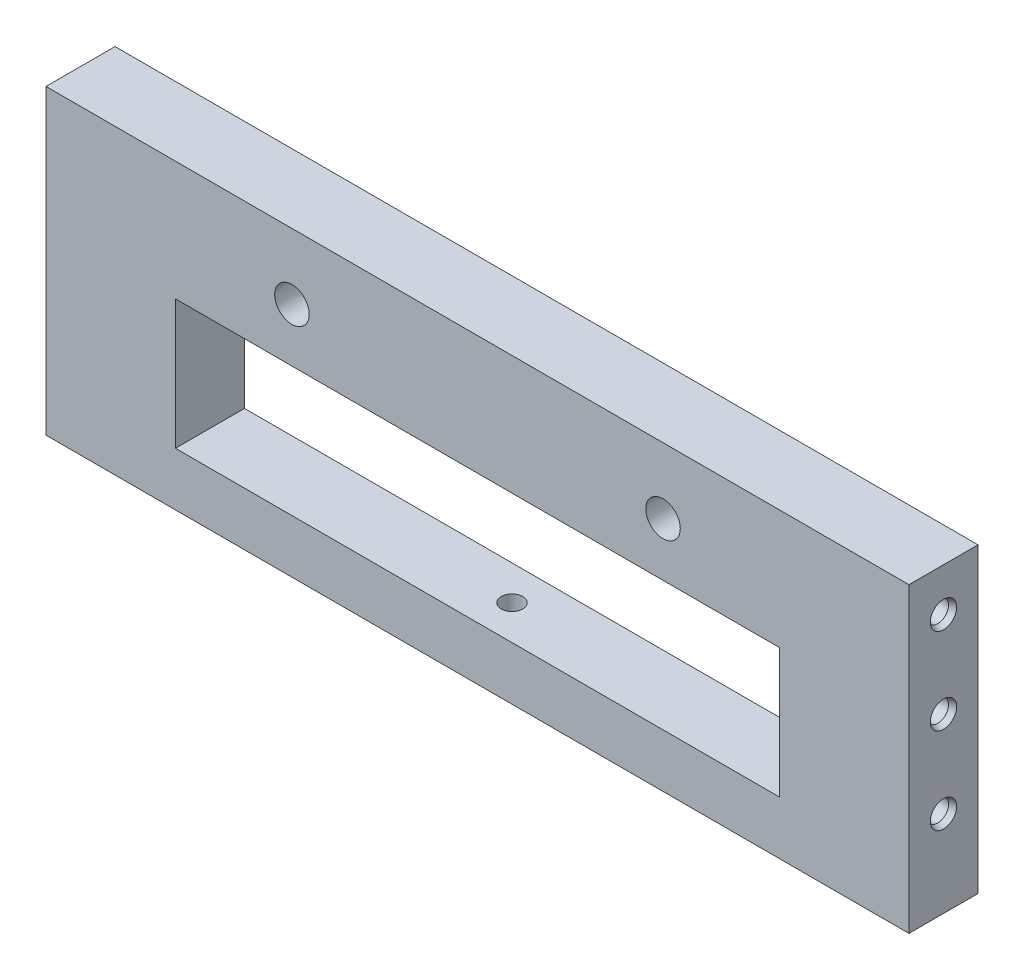
ISO-10303-21;
HEADER;
FILE_DESCRIPTION(('STEP AP214'),'2;1');
FILE_NAME('part.step','',(''),(''),'','','');
FILE_SCHEMA(('AUTOMOTIVE_DESIGN { 1 0 10303 214 1 1 1 1 }'));
ENDSEC;
DATA;
#1=APPLICATION_CONTEXT('core data for automotive mechanical design processes');
#2=APPLICATION_PROTOCOL_DEFINITION('international standard','automotive_design',2000,#1);
#3=PRODUCT_CONTEXT('',#1,'mechanical');
#4=PRODUCT('Part','Part','',(#3));
#5=PRODUCT_RELATED_PRODUCT_CATEGORY('part','',(#4));
#6=PRODUCT_DEFINITION_FORMATION('','',#4);
#7=PRODUCT_DEFINITION_CONTEXT('part definition',#1,'design');
#8=PRODUCT_DEFINITION('design','',#6,#7);
#9=PRODUCT_DEFINITION_SHAPE('','',#8);
#10=(LENGTH_UNIT() NAMED_UNIT(*) SI_UNIT(.MILLI.,.METRE.));
#11=(NAMED_UNIT(*) PLANE_ANGLE_UNIT() SI_UNIT($,.RADIAN.));
#12=(NAMED_UNIT(*) SI_UNIT($,.STERADIAN.) SOLID_ANGLE_UNIT());
#13=UNCERTAINTY_MEASURE_WITH_UNIT(LENGTH_MEASURE(1.E-05),#10,'distance_accuracy_value','');
#14=(GEOMETRIC_REPRESENTATION_CONTEXT(3) GLOBAL_UNCERTAINTY_ASSIGNED_CONTEXT((#13)) GLOBAL_UNIT_ASSIGNED_CONTEXT((#10,
#11,#12)) REPRESENTATION_CONTEXT('',''));
#15=CARTESIAN_POINT('',(0.,0.,0.));
#16=DIRECTION('',(0.,0.,1.));
#17=DIRECTION('',(1.,0.,0.));
#18=AXIS2_PLACEMENT_3D('',#15,#16,#17);
#19=CARTESIAN_POINT('',(-50.,0.,8.));
#20=DIRECTION('',(-1.,0.,0.));
#21=DIRECTION('',(0.,0.,1.));
#22=AXIS2_PLACEMENT_3D('',#19,#20,#21);
#23=PLANE('',#22);
#24=CARTESIAN_POINT('',(-50.,30.,4.));
#25=DIRECTION('',(-1.,0.,0.));
#26=DIRECTION('',(0.,0.,1.));
#27=AXIS2_PLACEMENT_3D('',#24,#25,#26);
#28=CIRCLE('',#27,1.525);
#29=CARTESIAN_POINT('',(-50.,30.,5.525));
#30=VERTEX_POINT('',#29);
#31=EDGE_CURVE('E267',#30,#30,#28,.T.);
#32=ORIENTED_EDGE('',*,*,#31,.F.);
#33=EDGE_LOOP('',(#32));
#34=FACE_BOUND('',#33,.T.);
#35=CARTESIAN_POINT('',(-50.,20.,4.));
#36=DIRECTION('',(-1.,0.,0.));
#37=DIRECTION('',(0.,0.,1.));
#38=AXIS2_PLACEMENT_3D('',#35,#36,#37);
#39=CIRCLE('',#38,1.525);
#40=CARTESIAN_POINT('',(-50.,20.,5.525));
#41=VERTEX_POINT('',#40);
#42=EDGE_CURVE('E276',#41,#41,#39,.T.);
#43=ORIENTED_EDGE('',*,*,#42,.F.);
#44=EDGE_LOOP('',(#43));
#45=FACE_BOUND('',#44,.T.);
#46=CARTESIAN_POINT('',(-50.,10.,4.));
#47=DIRECTION('',(-1.,0.,0.));
#48=DIRECTION('',(0.,0.,1.));
#49=AXIS2_PLACEMENT_3D('',#46,#47,#48);
#50=CIRCLE('',#49,1.525);
#51=CARTESIAN_POINT('',(-50.,10.,5.525));
#52=VERTEX_POINT('',#51);
#53=EDGE_CURVE('E285',#52,#52,#50,.T.);
#54=ORIENTED_EDGE('',*,*,#53,.F.);
#55=EDGE_LOOP('',(#54));
#56=FACE_BOUND('',#55,.T.);
#57=DIRECTION('',(0.,1.,0.));
#58=VECTOR('',#57,1.);
#59=CARTESIAN_POINT('',(-50.,0.,0.));
#60=LINE('',#59,#58);
#61=CARTESIAN_POINT('',(-50.,0.,0.));
#62=VERTEX_POINT('',#61);
#63=CARTESIAN_POINT('',(-50.,35.,0.));
#64=VERTEX_POINT('',#63);
#65=EDGE_CURVE('E156',#62,#64,#60,.T.);
#66=ORIENTED_EDGE('',*,*,#65,.F.);
#67=DIRECTION('',(0.,0.,-1.));
#68=VECTOR('',#67,1.);
#69=CARTESIAN_POINT('',(-50.,0.,8.));
#70=LINE('',#69,#68);
#71=CARTESIAN_POINT('',(-50.,0.,8.));
#72=VERTEX_POINT('',#71);
#73=EDGE_CURVE('E11',#72,#62,#70,.T.);
#74=ORIENTED_EDGE('',*,*,#73,.F.);
#75=DIRECTION('',(0.,1.,0.));
#76=VECTOR('',#75,1.);
#77=CARTESIAN_POINT('',(-50.,0.,8.));
#78=LINE('',#77,#76);
#79=CARTESIAN_POINT('',(-50.,35.,8.));
#80=VERTEX_POINT('',#79);
#81=EDGE_CURVE('E129',#72,#80,#78,.T.);
#82=ORIENTED_EDGE('',*,*,#81,.T.);
#83=DIRECTION('',(0.,0.,-1.));
#84=VECTOR('',#83,1.);
#85=CARTESIAN_POINT('',(-50.,35.,8.));
#86=LINE('',#85,#84);
#87=EDGE_CURVE('E57',#80,#64,#86,.T.);
#88=ORIENTED_EDGE('',*,*,#87,.T.);
#89=EDGE_LOOP('',(#66,#74,#82,#88));
#90=FACE_BOUND('',#89,.T.);
#91=ADVANCED_FACE('F38',(#34,#45,#56,#90),#23,.T.);
#92=CARTESIAN_POINT('',(0.,0.,8.));
#93=DIRECTION('',(0.,-1.,0.));
#94=DIRECTION('',(1.,0.,0.));
#95=AXIS2_PLACEMENT_3D('',#92,#93,#94);
#96=PLANE('',#95);
#97=CARTESIAN_POINT('',(40.,0.,4.));
#98=DIRECTION('',(0.,-1.,0.));
#99=DIRECTION('',(0.,0.,-1.));
#100=AXIS2_PLACEMENT_3D('',#97,#98,#99);
#101=CIRCLE('',#100,1.525);
#102=CARTESIAN_POINT('',(40.,0.,2.47500000000001));
#103=VERTEX_POINT('',#102);
#104=EDGE_CURVE('E614',#103,#103,#101,.T.);
#105=ORIENTED_EDGE('',*,*,#104,.F.);
#106=EDGE_LOOP('',(#105));
#107=FACE_BOUND('',#106,.T.);
#108=CARTESIAN_POINT('',(0.,0.,4.));
#109=DIRECTION('',(0.,-1.,0.));
#110=DIRECTION('',(0.,0.,-1.));
#111=AXIS2_PLACEMENT_3D('',#108,#109,#110);
#112=CIRCLE('',#111,1.525);
#113=CARTESIAN_POINT('',(0.,0.,2.475));
#114=VERTEX_POINT('',#113);
#115=EDGE_CURVE('E253',#114,#114,#112,.T.);
#116=ORIENTED_EDGE('',*,*,#115,.F.);
#117=EDGE_LOOP('',(#116));
#118=FACE_BOUND('',#117,.T.);
#119=CARTESIAN_POINT('',(-40.,0.,4.));
#120=DIRECTION('',(0.,-1.,0.));
#121=DIRECTION('',(0.,0.,-1.));
#122=AXIS2_PLACEMENT_3D('',#119,#120,#121);
#123=CIRCLE('',#122,1.525);
#124=CARTESIAN_POINT('',(-40.,0.,2.475));
#125=VERTEX_POINT('',#124);
#126=EDGE_CURVE('E247',#125,#125,#123,.T.);
#127=ORIENTED_EDGE('',*,*,#126,.F.);
#128=EDGE_LOOP('',(#127));
#129=FACE_BOUND('',#128,.T.);
#130=DIRECTION('',(-1.,0.,0.));
#131=VECTOR('',#130,1.);
#132=CARTESIAN_POINT('',(0.,0.,0.));
#133=LINE('',#132,#131);
#134=CARTESIAN_POINT('',(50.,0.,0.));
#135=VERTEX_POINT('',#134);
#136=EDGE_CURVE('E118',#135,#62,#133,.T.);
#137=ORIENTED_EDGE('',*,*,#136,.F.);
#138=DIRECTION('',(0.,0.,-1.));
#139=VECTOR('',#138,1.);
#140=CARTESIAN_POINT('',(50.,0.,8.));
#141=LINE('',#140,#139);
#142=CARTESIAN_POINT('',(50.,0.,8.));
#143=VERTEX_POINT('',#142);
#144=EDGE_CURVE('E48',#143,#135,#141,.T.);
#145=ORIENTED_EDGE('',*,*,#144,.F.);
#146=DIRECTION('',(-1.,0.,0.));
#147=VECTOR('',#146,1.);
#148=CARTESIAN_POINT('',(0.,0.,8.));
#149=LINE('',#148,#147);
#150=EDGE_CURVE('E116',#143,#72,#149,.T.);
#151=ORIENTED_EDGE('',*,*,#150,.T.);
#152=ORIENTED_EDGE('',*,*,#73,.T.);
#153=EDGE_LOOP('',(#137,#145,#151,#152));
#154=FACE_BOUND('',#153,.T.);
#155=ADVANCED_FACE('F115',(#107,#118,#129,#154),#96,.T.);
#156=CARTESIAN_POINT('',(50.,0.,8.));
#157=DIRECTION('',(1.,0.,0.));
#158=DIRECTION('',(0.,0.,-1.));
#159=AXIS2_PLACEMENT_3D('',#156,#157,#158);
#160=PLANE('',#159);
#161=CARTESIAN_POINT('',(50.,30.,4.));
#162=DIRECTION('',(1.,0.,0.));
#163=DIRECTION('',(0.,0.,-1.));
#164=AXIS2_PLACEMENT_3D('',#161,#162,#163);
#165=CIRCLE('',#164,1.525);
#166=CARTESIAN_POINT('',(50.,30.,2.475));
#167=VERTEX_POINT('',#166);
#168=EDGE_CURVE('E294',#167,#167,#165,.T.);
#169=ORIENTED_EDGE('',*,*,#168,.F.);
#170=EDGE_LOOP('',(#169));
#171=FACE_BOUND('',#170,.T.);
#172=CARTESIAN_POINT('',(50.,20.,4.));
#173=DIRECTION('',(1.,0.,0.));
#174=DIRECTION('',(0.,0.,-1.));
#175=AXIS2_PLACEMENT_3D('',#172,#173,#174);
#176=CIRCLE('',#175,1.525);
#177=CARTESIAN_POINT('',(50.,20.,2.475));
#178=VERTEX_POINT('',#177);
#179=EDGE_CURVE('E303',#178,#178,#176,.T.);
#180=ORIENTED_EDGE('',*,*,#179,.F.);
#181=EDGE_LOOP('',(#180));
#182=FACE_BOUND('',#181,.T.);
#183=CARTESIAN_POINT('',(50.,10.,4.));
#184=DIRECTION('',(1.,0.,0.));
#185=DIRECTION('',(0.,0.,-1.));
#186=AXIS2_PLACEMENT_3D('',#183,#184,#185);
#187=CIRCLE('',#186,1.525);
#188=CARTESIAN_POINT('',(50.,10.,2.475));
#189=VERTEX_POINT('',#188);
#190=EDGE_CURVE('E312',#189,#189,#187,.T.);
#191=ORIENTED_EDGE('',*,*,#190,.F.);
#192=EDGE_LOOP('',(#191));
#193=FACE_BOUND('',#192,.T.);
#194=DIRECTION('',(0.,-1.,0.));
#195=VECTOR('',#194,1.);
#196=CARTESIAN_POINT('',(50.,0.,0.));
#197=LINE('',#196,#195);
#198=CARTESIAN_POINT('',(50.,35.,0.));
#199=VERTEX_POINT('',#198);
#200=EDGE_CURVE('E159',#199,#135,#197,.T.);
#201=ORIENTED_EDGE('',*,*,#200,.F.);
#202=DIRECTION('',(0.,0.,-1.));
#203=VECTOR('',#202,1.);
#204=CARTESIAN_POINT('',(50.,35.,8.));
#205=LINE('',#204,#203);
#206=CARTESIAN_POINT('',(50.,35.,8.));
#207=VERTEX_POINT('',#206);
#208=EDGE_CURVE('E83',#207,#199,#205,.T.);
#209=ORIENTED_EDGE('',*,*,#208,.F.);
#210=DIRECTION('',(0.,-1.,0.));
#211=VECTOR('',#210,1.);
#212=CARTESIAN_POINT('',(50.,0.,8.));
#213=LINE('',#212,#211);
#214=EDGE_CURVE('E128',#207,#143,#213,.T.);
#215=ORIENTED_EDGE('',*,*,#214,.T.);
#216=ORIENTED_EDGE('',*,*,#144,.T.);
#217=EDGE_LOOP('',(#201,#209,#215,#216));
#218=FACE_BOUND('',#217,.T.);
#219=ADVANCED_FACE('F131',(#171,#182,#193,#218),#160,.T.);
#220=CARTESIAN_POINT('',(0.,6.185,8.));
#221=DIRECTION('',(0.,1.,0.));
#222=DIRECTION('',(0.,0.,1.));
#223=AXIS2_PLACEMENT_3D('',#220,#221,#222);
#224=PLANE('',#223);
#225=CARTESIAN_POINT('',(0.,6.185,4.));
#226=DIRECTION('',(0.,1.,0.));
#227=DIRECTION('',(0.,0.,1.));
#228=AXIS2_PLACEMENT_3D('',#225,#226,#227);
#229=CIRCLE('',#228,1.24999999999999);
#230=CARTESIAN_POINT('',(0.,6.185,5.24999999999999));
#231=VERTEX_POINT('',#230);
#232=EDGE_CURVE('E42',#231,#231,#229,.T.);
#233=ORIENTED_EDGE('',*,*,#232,.F.);
#234=EDGE_LOOP('',(#233));
#235=FACE_BOUND('',#234,.T.);
#236=DIRECTION('',(1.,0.,0.));
#237=VECTOR('',#236,1.);
#238=CARTESIAN_POINT('',(0.,6.185,0.));
#239=LINE('',#238,#237);
#240=CARTESIAN_POINT('',(-35.,6.185,0.));
#241=VERTEX_POINT('',#240);
#242=CARTESIAN_POINT('',(35.,6.185,0.));
#243=VERTEX_POINT('',#242);
#244=EDGE_CURVE('E138',#241,#243,#239,.T.);
#245=ORIENTED_EDGE('',*,*,#244,.F.);
#246=DIRECTION('',(0.,0.,-1.));
#247=VECTOR('',#246,1.);
#248=CARTESIAN_POINT('',(-35.,6.185,8.));
#249=LINE('',#248,#247);
#250=CARTESIAN_POINT('',(-35.,6.185,8.));
#251=VERTEX_POINT('',#250);
#252=EDGE_CURVE('E95',#251,#241,#249,.T.);
#253=ORIENTED_EDGE('',*,*,#252,.F.);
#254=DIRECTION('',(1.,0.,0.));
#255=VECTOR('',#254,1.);
#256=CARTESIAN_POINT('',(0.,6.185,8.));
#257=LINE('',#256,#255);
#258=CARTESIAN_POINT('',(35.,6.185,8.));
#259=VERTEX_POINT('',#258);
#260=EDGE_CURVE('E164',#251,#259,#257,.T.);
#261=ORIENTED_EDGE('',*,*,#260,.T.);
#262=DIRECTION('',(0.,0.,-1.));
#263=VECTOR('',#262,1.);
#264=CARTESIAN_POINT('',(35.,6.185,8.));
#265=LINE('',#264,#263);
#266=EDGE_CURVE('E134',#259,#243,#265,.T.);
#267=ORIENTED_EDGE('',*,*,#266,.T.);
#268=EDGE_LOOP('',(#245,#253,#261,#267));
#269=FACE_BOUND('',#268,.T.);
#270=ADVANCED_FACE('F40',(#235,#269),#224,.T.);
#271=CARTESIAN_POINT('',(-35.,0.,8.));
#272=DIRECTION('',(-1.,0.,0.));
#273=DIRECTION('',(0.,0.,1.));
#274=AXIS2_PLACEMENT_3D('',#271,#272,#273);
#275=PLANE('',#274);
#276=DIRECTION('',(0.,1.,0.));
#277=VECTOR('',#276,1.);
#278=CARTESIAN_POINT('',(-35.,0.,0.));
#279=LINE('',#278,#277);
#280=CARTESIAN_POINT('',(-35.,21.185,0.));
#281=VERTEX_POINT('',#280);
#282=EDGE_CURVE('E141',#241,#281,#279,.T.);
#283=ORIENTED_EDGE('',*,*,#282,.T.);
#284=DIRECTION('',(0.,0.,-1.));
#285=VECTOR('',#284,1.);
#286=CARTESIAN_POINT('',(-35.,21.185,8.));
#287=LINE('',#286,#285);
#288=CARTESIAN_POINT('',(-35.,21.185,8.));
#289=VERTEX_POINT('',#288);
#290=EDGE_CURVE('E170',#289,#281,#287,.T.);
#291=ORIENTED_EDGE('',*,*,#290,.F.);
#292=DIRECTION('',(0.,1.,0.));
#293=VECTOR('',#292,1.);
#294=CARTESIAN_POINT('',(-35.,0.,8.));
#295=LINE('',#294,#293);
#296=EDGE_CURVE('E176',#251,#289,#295,.T.);
#297=ORIENTED_EDGE('',*,*,#296,.F.);
#298=ORIENTED_EDGE('',*,*,#252,.T.);
#299=EDGE_LOOP('',(#283,#291,#297,#298));
#300=FACE_BOUND('',#299,.T.);
#301=ADVANCED_FACE('F174',(#300),#275,.F.);
#302=CARTESIAN_POINT('',(0.,21.185,8.));
#303=DIRECTION('',(0.,1.,0.));
#304=DIRECTION('',(0.,0.,1.));
#305=AXIS2_PLACEMENT_3D('',#302,#303,#304);
#306=PLANE('',#305);
#307=DIRECTION('',(1.,0.,0.));
#308=VECTOR('',#307,1.);
#309=CARTESIAN_POINT('',(0.,21.185,0.));
#310=LINE('',#309,#308);
#311=CARTESIAN_POINT('',(35.,21.185,0.));
#312=VERTEX_POINT('',#311);
#313=EDGE_CURVE('E144',#281,#312,#310,.T.);
#314=ORIENTED_EDGE('',*,*,#313,.T.);
#315=DIRECTION('',(0.,0.,-1.));
#316=VECTOR('',#315,1.);
#317=CARTESIAN_POINT('',(35.,21.185,8.));
#318=LINE('',#317,#316);
#319=CARTESIAN_POINT('',(35.,21.185,8.));
#320=VERTEX_POINT('',#319);
#321=EDGE_CURVE('E168',#320,#312,#318,.T.);
#322=ORIENTED_EDGE('',*,*,#321,.F.);
#323=DIRECTION('',(1.,0.,0.));
#324=VECTOR('',#323,1.);
#325=CARTESIAN_POINT('',(0.,21.185,8.));
#326=LINE('',#325,#324);
#327=EDGE_CURVE('E192',#289,#320,#326,.T.);
#328=ORIENTED_EDGE('',*,*,#327,.F.);
#329=ORIENTED_EDGE('',*,*,#290,.T.);
#330=EDGE_LOOP('',(#314,#322,#328,#329));
#331=FACE_BOUND('',#330,.T.);
#332=ADVANCED_FACE('F191',(#331),#306,.F.);
#333=CARTESIAN_POINT('',(-21.5,27.37,8.));
#334=DIRECTION('',(0.,0.,-1.));
#335=DIRECTION('',(-1.,0.,0.));
#336=AXIS2_PLACEMENT_3D('',#333,#334,#335);
#337=CYLINDRICAL_SURFACE('',#336,2.);
#338=CARTESIAN_POINT('',(-21.5,27.37,8.));
#339=DIRECTION('',(0.,0.,1.));
#340=DIRECTION('',(1.,0.,0.));
#341=AXIS2_PLACEMENT_3D('',#338,#339,#340);
#342=CIRCLE('',#341,2.);
#343=CARTESIAN_POINT('',(-19.5,27.37,8.));
#344=VERTEX_POINT('',#343);
#345=EDGE_CURVE('E202',#344,#344,#342,.T.);
#346=ORIENTED_EDGE('',*,*,#345,.T.);
#347=EDGE_LOOP('',(#346));
#348=FACE_BOUND('',#347,.T.);
#349=CARTESIAN_POINT('',(-21.5,27.37,0.));
#350=DIRECTION('',(0.,0.,1.));
#351=DIRECTION('',(1.,0.,0.));
#352=AXIS2_PLACEMENT_3D('',#349,#350,#351);
#353=CIRCLE('',#352,2.);
#354=CARTESIAN_POINT('',(-19.5,27.37,0.));
#355=VERTEX_POINT('',#354);
#356=EDGE_CURVE('E153',#355,#355,#353,.T.);
#357=ORIENTED_EDGE('',*,*,#356,.F.);
#358=EDGE_LOOP('',(#357));
#359=FACE_BOUND('',#358,.T.);
#360=ADVANCED_FACE('F227',(#348,#359),#337,.F.);
#361=CARTESIAN_POINT('',(21.5,27.37,8.));
#362=DIRECTION('',(0.,0.,-1.));
#363=DIRECTION('',(-1.,0.,0.));
#364=AXIS2_PLACEMENT_3D('',#361,#362,#363);
#365=CYLINDRICAL_SURFACE('',#364,2.);
#366=CARTESIAN_POINT('',(21.5,27.37,8.));
#367=DIRECTION('',(0.,0.,1.));
#368=DIRECTION('',(1.,0.,0.));
#369=AXIS2_PLACEMENT_3D('',#366,#367,#368);
#370=CIRCLE('',#369,2.);
#371=CARTESIAN_POINT('',(23.5,27.37,8.));
#372=VERTEX_POINT('',#371);
#373=EDGE_CURVE('E195',#372,#372,#370,.T.);
#374=ORIENTED_EDGE('',*,*,#373,.T.);
#375=EDGE_LOOP('',(#374));
#376=FACE_BOUND('',#375,.T.);
#377=CARTESIAN_POINT('',(21.5,27.37,0.));
#378=DIRECTION('',(0.,0.,1.));
#379=DIRECTION('',(1.,0.,0.));
#380=AXIS2_PLACEMENT_3D('',#377,#378,#379);
#381=CIRCLE('',#380,2.);
#382=CARTESIAN_POINT('',(23.5,27.37,0.));
#383=VERTEX_POINT('',#382);
#384=EDGE_CURVE('E150',#383,#383,#381,.T.);
#385=ORIENTED_EDGE('',*,*,#384,.F.);
#386=EDGE_LOOP('',(#385));
#387=FACE_BOUND('',#386,.T.);
#388=ADVANCED_FACE('F212',(#376,#387),#365,.F.);
#389=CARTESIAN_POINT('',(35.,0.,8.));
#390=DIRECTION('',(-1.,0.,0.));
#391=DIRECTION('',(0.,0.,1.));
#392=AXIS2_PLACEMENT_3D('',#389,#390,#391);
#393=PLANE('',#392);
#394=DIRECTION('',(0.,1.,0.));
#395=VECTOR('',#394,1.);
#396=CARTESIAN_POINT('',(35.,0.,0.));
#397=LINE('',#396,#395);
#398=EDGE_CURVE('E147',#243,#312,#397,.T.);
#399=ORIENTED_EDGE('',*,*,#398,.F.);
#400=ORIENTED_EDGE('',*,*,#266,.F.);
#401=DIRECTION('',(0.,1.,0.));
#402=VECTOR('',#401,1.);
#403=CARTESIAN_POINT('',(35.,0.,8.));
#404=LINE('',#403,#402);
#405=EDGE_CURVE('E187',#259,#320,#404,.T.);
#406=ORIENTED_EDGE('',*,*,#405,.T.);
#407=ORIENTED_EDGE('',*,*,#321,.T.);
#408=EDGE_LOOP('',(#399,#400,#406,#407));
#409=FACE_BOUND('',#408,.T.);
#410=ADVANCED_FACE('F186',(#409),#393,.T.);
#411=CARTESIAN_POINT('',(0.,35.,8.));
#412=DIRECTION('',(0.,1.,0.));
#413=DIRECTION('',(0.,0.,1.));
#414=AXIS2_PLACEMENT_3D('',#411,#412,#413);
#415=PLANE('',#414);
#416=DIRECTION('',(1.,0.,0.));
#417=VECTOR('',#416,1.);
#418=CARTESIAN_POINT('',(0.,35.,0.));
#419=LINE('',#418,#417);
#420=EDGE_CURVE('E161',#64,#199,#419,.T.);
#421=ORIENTED_EDGE('',*,*,#420,.F.);
#422=ORIENTED_EDGE('',*,*,#87,.F.);
#423=DIRECTION('',(1.,0.,0.));
#424=VECTOR('',#423,1.);
#425=CARTESIAN_POINT('',(0.,35.,8.));
#426=LINE('',#425,#424);
#427=EDGE_CURVE('E132',#80,#207,#426,.T.);
#428=ORIENTED_EDGE('',*,*,#427,.T.);
#429=ORIENTED_EDGE('',*,*,#208,.T.);
#430=EDGE_LOOP('',(#421,#422,#428,#429));
#431=FACE_BOUND('',#430,.T.);
#432=ADVANCED_FACE('F204',(#431),#415,.T.);
#433=CARTESIAN_POINT('',(0.,0.,8.));
#434=DIRECTION('',(0.,0.,1.));
#435=DIRECTION('',(1.,0.,0.));
#436=AXIS2_PLACEMENT_3D('',#433,#434,#435);
#437=PLANE('',#436);
#438=ORIENTED_EDGE('',*,*,#260,.F.);
#439=ORIENTED_EDGE('',*,*,#296,.T.);
#440=ORIENTED_EDGE('',*,*,#327,.T.);
#441=ORIENTED_EDGE('',*,*,#405,.F.);
#442=EDGE_LOOP('',(#438,#439,#440,#441));
#443=FACE_BOUND('',#442,.T.);
#444=ORIENTED_EDGE('',*,*,#373,.F.);
#445=EDGE_LOOP('',(#444));
#446=FACE_BOUND('',#445,.T.);
#447=ORIENTED_EDGE('',*,*,#345,.F.);
#448=EDGE_LOOP('',(#447));
#449=FACE_BOUND('',#448,.T.);
#450=ORIENTED_EDGE('',*,*,#81,.F.);
#451=ORIENTED_EDGE('',*,*,#150,.F.);
#452=ORIENTED_EDGE('',*,*,#214,.F.);
#453=ORIENTED_EDGE('',*,*,#427,.F.);
#454=EDGE_LOOP('',(#450,#451,#452,#453));
#455=FACE_BOUND('',#454,.T.);
#456=ADVANCED_FACE('F126',(#443,#446,#449,#455),#437,.T.);
#457=CARTESIAN_POINT('',(0.,0.,0.));
#458=DIRECTION('',(0.,0.,1.));
#459=DIRECTION('',(1.,0.,0.));
#460=AXIS2_PLACEMENT_3D('',#457,#458,#459);
#461=PLANE('',#460);
#462=ORIENTED_EDGE('',*,*,#244,.T.);
#463=ORIENTED_EDGE('',*,*,#398,.T.);
#464=ORIENTED_EDGE('',*,*,#313,.F.);
#465=ORIENTED_EDGE('',*,*,#282,.F.);
#466=EDGE_LOOP('',(#462,#463,#464,#465));
#467=FACE_BOUND('',#466,.T.);
#468=ORIENTED_EDGE('',*,*,#384,.T.);
#469=EDGE_LOOP('',(#468));
#470=FACE_BOUND('',#469,.T.);
#471=ORIENTED_EDGE('',*,*,#356,.T.);
#472=EDGE_LOOP('',(#471));
#473=FACE_BOUND('',#472,.T.);
#474=ORIENTED_EDGE('',*,*,#65,.T.);
#475=ORIENTED_EDGE('',*,*,#420,.T.);
#476=ORIENTED_EDGE('',*,*,#200,.T.);
#477=ORIENTED_EDGE('',*,*,#136,.T.);
#478=EDGE_LOOP('',(#474,#475,#476,#477));
#479=FACE_BOUND('',#478,.T.);
#480=ADVANCED_FACE('F180',(#467,#470,#473,#479),#461,.F.);
#481=CARTESIAN_POINT('',(43.2510757737845,10.,4.));
#482=DIRECTION('',(1.,0.,0.));
#483=DIRECTION('',(0.,0.,-1.));
#484=AXIS2_PLACEMENT_3D('',#481,#482,#483);
#485=CONICAL_SURFACE('',#484,1.25,1.02974425867665);
#486=CARTESIAN_POINT('',(42.5,10.,4.));
#487=VERTEX_POINT('',#486);
#488=VERTEX_LOOP('',#487);
#489=FACE_BOUND('',#488,.T.);
#490=CARTESIAN_POINT('',(43.2510757737845,10.,4.));
#491=DIRECTION('',(1.,0.,0.));
#492=DIRECTION('',(0.,0.,-1.));
#493=AXIS2_PLACEMENT_3D('',#490,#491,#492);
#494=CIRCLE('',#493,1.25);
#495=CARTESIAN_POINT('',(43.2510757737845,10.,2.75));
#496=VERTEX_POINT('',#495);
#497=EDGE_CURVE('E142',#496,#496,#494,.T.);
#498=ORIENTED_EDGE('',*,*,#497,.T.);
#499=EDGE_LOOP('',(#498));
#500=FACE_BOUND('',#499,.T.);
#501=ADVANCED_FACE('F321',(#489,#500),#485,.F.);
#502=CARTESIAN_POINT('',(50.,10.,4.));
#503=DIRECTION('',(1.,0.,0.));
#504=DIRECTION('',(0.,0.,-1.));
#505=AXIS2_PLACEMENT_3D('',#502,#503,#504);
#506=CYLINDRICAL_SURFACE('',#505,1.24999999999999);
#507=ORIENTED_EDGE('',*,*,#497,.F.);
#508=EDGE_LOOP('',(#507));
#509=FACE_BOUND('',#508,.T.);
#510=CARTESIAN_POINT('',(49.3360912703474,10.,4.));
#511=DIRECTION('',(1.,0.,0.));
#512=DIRECTION('',(0.,0.,-1.));
#513=AXIS2_PLACEMENT_3D('',#510,#511,#512);
#514=CIRCLE('',#513,1.24999999999999);
#515=CARTESIAN_POINT('',(49.3360912703474,10.,2.75000000000001));
#516=VERTEX_POINT('',#515);
#517=EDGE_CURVE('E315',#516,#516,#514,.T.);
#518=ORIENTED_EDGE('',*,*,#517,.T.);
#519=EDGE_LOOP('',(#518));
#520=FACE_BOUND('',#519,.T.);
#521=ADVANCED_FACE('F323',(#509,#520),#506,.F.);
#522=CARTESIAN_POINT('',(50.,10.,4.));
#523=DIRECTION('',(1.,0.,0.));
#524=DIRECTION('',(0.,0.,-1.));
#525=AXIS2_PLACEMENT_3D('',#522,#523,#524);
#526=CONICAL_SURFACE('',#525,1.525,0.392699081698713);
#527=ORIENTED_EDGE('',*,*,#517,.F.);
#528=EDGE_LOOP('',(#527));
#529=FACE_BOUND('',#528,.T.);
#530=ORIENTED_EDGE('',*,*,#190,.T.);
#531=EDGE_LOOP('',(#530));
#532=FACE_BOUND('',#531,.T.);
#533=ADVANCED_FACE('F326',(#529,#532),#526,.F.);
#534=CARTESIAN_POINT('',(43.2510757737845,20.,4.));
#535=DIRECTION('',(1.,0.,0.));
#536=DIRECTION('',(0.,0.,-1.));
#537=AXIS2_PLACEMENT_3D('',#534,#535,#536);
#538=CONICAL_SURFACE('',#537,1.25,1.02974425867665);
#539=CARTESIAN_POINT('',(42.5,20.,4.));
#540=VERTEX_POINT('',#539);
#541=VERTEX_LOOP('',#540);
#542=FACE_BOUND('',#541,.T.);
#543=CARTESIAN_POINT('',(43.2510757737845,20.,4.));
#544=DIRECTION('',(1.,0.,0.));
#545=DIRECTION('',(0.,0.,-1.));
#546=AXIS2_PLACEMENT_3D('',#543,#544,#545);
#547=CIRCLE('',#546,1.25);
#548=CARTESIAN_POINT('',(43.2510757737845,20.,2.75));
#549=VERTEX_POINT('',#548);
#550=EDGE_CURVE('E309',#549,#549,#547,.T.);
#551=ORIENTED_EDGE('',*,*,#550,.T.);
#552=EDGE_LOOP('',(#551));
#553=FACE_BOUND('',#552,.T.);
#554=ADVANCED_FACE('F332',(#542,#553),#538,.F.);
#555=CARTESIAN_POINT('',(50.,20.,4.));
#556=DIRECTION('',(1.,0.,0.));
#557=DIRECTION('',(0.,0.,-1.));
#558=AXIS2_PLACEMENT_3D('',#555,#556,#557);
#559=CYLINDRICAL_SURFACE('',#558,1.24999999999999);
#560=ORIENTED_EDGE('',*,*,#550,.F.);
#561=EDGE_LOOP('',(#560));
#562=FACE_BOUND('',#561,.T.);
#563=CARTESIAN_POINT('',(49.3360912703474,20.,4.));
#564=DIRECTION('',(1.,0.,0.));
#565=DIRECTION('',(0.,0.,-1.));
#566=AXIS2_PLACEMENT_3D('',#563,#564,#565);
#567=CIRCLE('',#566,1.24999999999999);
#568=CARTESIAN_POINT('',(49.3360912703474,20.,2.75000000000001));
#569=VERTEX_POINT('',#568);
#570=EDGE_CURVE('E306',#569,#569,#567,.T.);
#571=ORIENTED_EDGE('',*,*,#570,.T.);
#572=EDGE_LOOP('',(#571));
#573=FACE_BOUND('',#572,.T.);
#574=ADVANCED_FACE('F339',(#562,#573),#559,.F.);
#575=CARTESIAN_POINT('',(50.,20.,4.));
#576=DIRECTION('',(1.,0.,0.));
#577=DIRECTION('',(0.,0.,-1.));
#578=AXIS2_PLACEMENT_3D('',#575,#576,#577);
#579=CONICAL_SURFACE('',#578,1.525,0.392699081698713);
#580=ORIENTED_EDGE('',*,*,#570,.F.);
#581=EDGE_LOOP('',(#580));
#582=FACE_BOUND('',#581,.T.);
#583=ORIENTED_EDGE('',*,*,#179,.T.);
#584=EDGE_LOOP('',(#583));
#585=FACE_BOUND('',#584,.T.);
#586=ADVANCED_FACE('F379',(#582,#585),#579,.F.);
#587=CARTESIAN_POINT('',(43.2510757737845,30.,4.));
#588=DIRECTION('',(1.,0.,0.));
#589=DIRECTION('',(0.,0.,-1.));
#590=AXIS2_PLACEMENT_3D('',#587,#588,#589);
#591=CONICAL_SURFACE('',#590,1.25,1.02974425867665);
#592=CARTESIAN_POINT('',(42.5,30.,4.));
#593=VERTEX_POINT('',#592);
#594=VERTEX_LOOP('',#593);
#595=FACE_BOUND('',#594,.T.);
#596=CARTESIAN_POINT('',(43.2510757737845,30.,4.));
#597=DIRECTION('',(1.,0.,0.));
#598=DIRECTION('',(0.,0.,-1.));
#599=AXIS2_PLACEMENT_3D('',#596,#597,#598);
#600=CIRCLE('',#599,1.25);
#601=CARTESIAN_POINT('',(43.2510757737845,30.,2.75));
#602=VERTEX_POINT('',#601);
#603=EDGE_CURVE('E300',#602,#602,#600,.T.);
#604=ORIENTED_EDGE('',*,*,#603,.T.);
#605=EDGE_LOOP('',(#604));
#606=FACE_BOUND('',#605,.T.);
#607=ADVANCED_FACE('F388',(#595,#606),#591,.F.);
#608=CARTESIAN_POINT('',(50.,30.,4.));
#609=DIRECTION('',(1.,0.,0.));
#610=DIRECTION('',(0.,0.,-1.));
#611=AXIS2_PLACEMENT_3D('',#608,#609,#610);
#612=CYLINDRICAL_SURFACE('',#611,1.24999999999999);
#613=ORIENTED_EDGE('',*,*,#603,.F.);
#614=EDGE_LOOP('',(#613));
#615=FACE_BOUND('',#614,.T.);
#616=CARTESIAN_POINT('',(49.3360912703474,30.,4.));
#617=DIRECTION('',(1.,0.,0.));
#618=DIRECTION('',(0.,0.,-1.));
#619=AXIS2_PLACEMENT_3D('',#616,#617,#618);
#620=CIRCLE('',#619,1.24999999999999);
#621=CARTESIAN_POINT('',(49.3360912703474,30.,2.75000000000001));
#622=VERTEX_POINT('',#621);
#623=EDGE_CURVE('E297',#622,#622,#620,.T.);
#624=ORIENTED_EDGE('',*,*,#623,.T.);
#625=EDGE_LOOP('',(#624));
#626=FACE_BOUND('',#625,.T.);
#627=ADVANCED_FACE('F398',(#615,#626),#612,.F.);
#628=CARTESIAN_POINT('',(50.,30.,4.));
#629=DIRECTION('',(1.,0.,0.));
#630=DIRECTION('',(0.,0.,-1.));
#631=AXIS2_PLACEMENT_3D('',#628,#629,#630);
#632=CONICAL_SURFACE('',#631,1.525,0.392699081698713);
#633=ORIENTED_EDGE('',*,*,#623,.F.);
#634=EDGE_LOOP('',(#633));
#635=FACE_BOUND('',#634,.T.);
#636=ORIENTED_EDGE('',*,*,#168,.T.);
#637=EDGE_LOOP('',(#636));
#638=FACE_BOUND('',#637,.T.);
#639=ADVANCED_FACE('F408',(#635,#638),#632,.F.);
#640=CARTESIAN_POINT('',(-43.2510757737845,10.,4.));
#641=DIRECTION('',(-1.,0.,0.));
#642=DIRECTION('',(0.,0.,1.));
#643=AXIS2_PLACEMENT_3D('',#640,#641,#642);
#644=CONICAL_SURFACE('',#643,1.25,1.02974425867665);
#645=CARTESIAN_POINT('',(-42.5,10.,4.));
#646=VERTEX_POINT('',#645);
#647=VERTEX_LOOP('',#646);
#648=FACE_BOUND('',#647,.T.);
#649=CARTESIAN_POINT('',(-43.2510757737845,10.,4.));
#650=DIRECTION('',(-1.,0.,0.));
#651=DIRECTION('',(0.,0.,1.));
#652=AXIS2_PLACEMENT_3D('',#649,#650,#651);
#653=CIRCLE('',#652,1.25);
#654=CARTESIAN_POINT('',(-43.2510757737845,10.,5.25));
#655=VERTEX_POINT('',#654);
#656=EDGE_CURVE('E291',#655,#655,#653,.T.);
#657=ORIENTED_EDGE('',*,*,#656,.T.);
#658=EDGE_LOOP('',(#657));
#659=FACE_BOUND('',#658,.T.);
#660=ADVANCED_FACE('F417',(#648,#659),#644,.F.);
#661=CARTESIAN_POINT('',(-50.,10.,4.));
#662=DIRECTION('',(-1.,0.,0.));
#663=DIRECTION('',(0.,0.,1.));
#664=AXIS2_PLACEMENT_3D('',#661,#662,#663);
#665=CYLINDRICAL_SURFACE('',#664,1.24999999999999);
#666=ORIENTED_EDGE('',*,*,#656,.F.);
#667=EDGE_LOOP('',(#666));
#668=FACE_BOUND('',#667,.T.);
#669=CARTESIAN_POINT('',(-49.3360912703474,10.,4.));
#670=DIRECTION('',(-1.,0.,0.));
#671=DIRECTION('',(0.,0.,1.));
#672=AXIS2_PLACEMENT_3D('',#669,#670,#671);
#673=CIRCLE('',#672,1.24999999999999);
#674=CARTESIAN_POINT('',(-49.3360912703474,10.,5.24999999999999));
#675=VERTEX_POINT('',#674);
#676=EDGE_CURVE('E288',#675,#675,#673,.T.);
#677=ORIENTED_EDGE('',*,*,#676,.T.);
#678=EDGE_LOOP('',(#677));
#679=FACE_BOUND('',#678,.T.);
#680=ADVANCED_FACE('F433',(#668,#679),#665,.F.);
#681=CARTESIAN_POINT('',(-50.,10.,4.));
#682=DIRECTION('',(-1.,0.,0.));
#683=DIRECTION('',(0.,0.,1.));
#684=AXIS2_PLACEMENT_3D('',#681,#682,#683);
#685=CONICAL_SURFACE('',#684,1.525,0.392699081698713);
#686=ORIENTED_EDGE('',*,*,#676,.F.);
#687=EDGE_LOOP('',(#686));
#688=FACE_BOUND('',#687,.T.);
#689=ORIENTED_EDGE('',*,*,#53,.T.);
#690=EDGE_LOOP('',(#689));
#691=FACE_BOUND('',#690,.T.);
#692=ADVANCED_FACE('F443',(#688,#691),#685,.F.);
#693=CARTESIAN_POINT('',(-43.2510757737845,20.,4.));
#694=DIRECTION('',(-1.,0.,0.));
#695=DIRECTION('',(0.,0.,1.));
#696=AXIS2_PLACEMENT_3D('',#693,#694,#695);
#697=CONICAL_SURFACE('',#696,1.25,1.02974425867665);
#698=CARTESIAN_POINT('',(-42.5,20.,4.));
#699=VERTEX_POINT('',#698);
#700=VERTEX_LOOP('',#699);
#701=FACE_BOUND('',#700,.T.);
#702=CARTESIAN_POINT('',(-43.2510757737845,20.,4.));
#703=DIRECTION('',(-1.,0.,0.));
#704=DIRECTION('',(0.,0.,1.));
#705=AXIS2_PLACEMENT_3D('',#702,#703,#704);
#706=CIRCLE('',#705,1.25);
#707=CARTESIAN_POINT('',(-43.2510757737845,20.,5.25));
#708=VERTEX_POINT('',#707);
#709=EDGE_CURVE('E282',#708,#708,#706,.T.);
#710=ORIENTED_EDGE('',*,*,#709,.T.);
#711=EDGE_LOOP('',(#710));
#712=FACE_BOUND('',#711,.T.);
#713=ADVANCED_FACE('F453',(#701,#712),#697,.F.);
#714=CARTESIAN_POINT('',(-50.,20.,4.));
#715=DIRECTION('',(-1.,0.,0.));
#716=DIRECTION('',(0.,0.,1.));
#717=AXIS2_PLACEMENT_3D('',#714,#715,#716);
#718=CYLINDRICAL_SURFACE('',#717,1.24999999999999);
#719=ORIENTED_EDGE('',*,*,#709,.F.);
#720=EDGE_LOOP('',(#719));
#721=FACE_BOUND('',#720,.T.);
#722=CARTESIAN_POINT('',(-49.3360912703474,20.,4.));
#723=DIRECTION('',(-1.,0.,0.));
#724=DIRECTION('',(0.,0.,1.));
#725=AXIS2_PLACEMENT_3D('',#722,#723,#724);
#726=CIRCLE('',#725,1.24999999999999);
#727=CARTESIAN_POINT('',(-49.3360912703474,20.,5.24999999999999));
#728=VERTEX_POINT('',#727);
#729=EDGE_CURVE('E279',#728,#728,#726,.T.);
#730=ORIENTED_EDGE('',*,*,#729,.T.);
#731=EDGE_LOOP('',(#730));
#732=FACE_BOUND('',#731,.T.);
#733=ADVANCED_FACE('F463',(#721,#732),#718,.F.);
#734=CARTESIAN_POINT('',(-50.,20.,4.));
#735=DIRECTION('',(-1.,0.,0.));
#736=DIRECTION('',(0.,0.,1.));
#737=AXIS2_PLACEMENT_3D('',#734,#735,#736);
#738=CONICAL_SURFACE('',#737,1.525,0.392699081698713);
#739=ORIENTED_EDGE('',*,*,#729,.F.);
#740=EDGE_LOOP('',(#739));
#741=FACE_BOUND('',#740,.T.);
#742=ORIENTED_EDGE('',*,*,#42,.T.);
#743=EDGE_LOOP('',(#742));
#744=FACE_BOUND('',#743,.T.);
#745=ADVANCED_FACE('F473',(#741,#744),#738,.F.);
#746=CARTESIAN_POINT('',(-43.2510757737845,30.,4.));
#747=DIRECTION('',(-1.,0.,0.));
#748=DIRECTION('',(0.,0.,1.));
#749=AXIS2_PLACEMENT_3D('',#746,#747,#748);
#750=CONICAL_SURFACE('',#749,1.25,1.02974425867666);
#751=CARTESIAN_POINT('',(-42.5,30.,4.));
#752=VERTEX_POINT('',#751);
#753=VERTEX_LOOP('',#752);
#754=FACE_BOUND('',#753,.T.);
#755=CARTESIAN_POINT('',(-43.2510757737845,30.,4.));
#756=DIRECTION('',(-1.,0.,0.));
#757=DIRECTION('',(0.,0.,1.));
#758=AXIS2_PLACEMENT_3D('',#755,#756,#757);
#759=CIRCLE('',#758,1.25);
#760=CARTESIAN_POINT('',(-43.2510757737845,30.,5.25));
#761=VERTEX_POINT('',#760);
#762=EDGE_CURVE('E273',#761,#761,#759,.T.);
#763=ORIENTED_EDGE('',*,*,#762,.T.);
#764=EDGE_LOOP('',(#763));
#765=FACE_BOUND('',#764,.T.);
#766=ADVANCED_FACE('F483',(#754,#765),#750,.F.);
#767=CARTESIAN_POINT('',(-50.,30.,4.));
#768=DIRECTION('',(-1.,0.,0.));
#769=DIRECTION('',(0.,0.,1.));
#770=AXIS2_PLACEMENT_3D('',#767,#768,#769);
#771=CYLINDRICAL_SURFACE('',#770,1.24999999999999);
#772=ORIENTED_EDGE('',*,*,#762,.F.);
#773=EDGE_LOOP('',(#772));
#774=FACE_BOUND('',#773,.T.);
#775=CARTESIAN_POINT('',(-49.3360912703474,30.,4.));
#776=DIRECTION('',(-1.,0.,0.));
#777=DIRECTION('',(0.,0.,1.));
#778=AXIS2_PLACEMENT_3D('',#775,#776,#777);
#779=CIRCLE('',#778,1.24999999999999);
#780=CARTESIAN_POINT('',(-49.3360912703474,30.,5.24999999999999));
#781=VERTEX_POINT('',#780);
#782=EDGE_CURVE('E270',#781,#781,#779,.T.);
#783=ORIENTED_EDGE('',*,*,#782,.T.);
#784=EDGE_LOOP('',(#783));
#785=FACE_BOUND('',#784,.T.);
#786=ADVANCED_FACE('F493',(#774,#785),#771,.F.);
#787=CARTESIAN_POINT('',(-50.,30.,4.));
#788=DIRECTION('',(-1.,0.,0.));
#789=DIRECTION('',(0.,0.,1.));
#790=AXIS2_PLACEMENT_3D('',#787,#788,#789);
#791=CONICAL_SURFACE('',#790,1.525,0.392699081698713);
#792=ORIENTED_EDGE('',*,*,#782,.F.);
#793=EDGE_LOOP('',(#792));
#794=FACE_BOUND('',#793,.T.);
#795=ORIENTED_EDGE('',*,*,#31,.T.);
#796=EDGE_LOOP('',(#795));
#797=FACE_BOUND('',#796,.T.);
#798=ADVANCED_FACE('F503',(#794,#797),#791,.F.);
#799=CARTESIAN_POINT('',(-40.,6.74892422621555,4.));
#800=DIRECTION('',(0.,-1.,0.));
#801=DIRECTION('',(0.,0.,-1.));
#802=AXIS2_PLACEMENT_3D('',#799,#800,#801);
#803=CONICAL_SURFACE('',#802,1.25,1.02974425867665);
#804=CARTESIAN_POINT('',(-40.,7.5,4.));
#805=VERTEX_POINT('',#804);
#806=VERTEX_LOOP('',#805);
#807=FACE_BOUND('',#806,.T.);
#808=CARTESIAN_POINT('',(-40.,6.74892422621555,4.));
#809=DIRECTION('',(0.,-1.,0.));
#810=DIRECTION('',(0.,0.,-1.));
#811=AXIS2_PLACEMENT_3D('',#808,#809,#810);
#812=CIRCLE('',#811,1.25);
#813=CARTESIAN_POINT('',(-40.,6.74892422621555,2.75));
#814=VERTEX_POINT('',#813);
#815=EDGE_CURVE('E264',#814,#814,#812,.T.);
#816=ORIENTED_EDGE('',*,*,#815,.T.);
#817=EDGE_LOOP('',(#816));
#818=FACE_BOUND('',#817,.T.);
#819=ADVANCED_FACE('F513',(#807,#818),#803,.F.);
#820=CARTESIAN_POINT('',(-40.,0.,4.));
#821=DIRECTION('',(0.,-1.,0.));
#822=DIRECTION('',(0.,0.,-1.));
#823=AXIS2_PLACEMENT_3D('',#820,#821,#822);
#824=CYLINDRICAL_SURFACE('',#823,1.24999999999999);
#825=ORIENTED_EDGE('',*,*,#815,.F.);
#826=EDGE_LOOP('',(#825));
#827=FACE_BOUND('',#826,.T.);
#828=CARTESIAN_POINT('',(-40.,0.663908729652646,4.));
#829=DIRECTION('',(0.,-1.,0.));
#830=DIRECTION('',(0.,0.,-1.));
#831=AXIS2_PLACEMENT_3D('',#828,#829,#830);
#832=CIRCLE('',#831,1.24999999999999);
#833=CARTESIAN_POINT('',(-40.,0.663908729652646,2.75000000000001));
#834=VERTEX_POINT('',#833);
#835=EDGE_CURVE('E250',#834,#834,#832,.T.);
#836=ORIENTED_EDGE('',*,*,#835,.T.);
#837=EDGE_LOOP('',(#836));
#838=FACE_BOUND('',#837,.T.);
#839=ADVANCED_FACE('F535',(#827,#838),#824,.F.);
#840=CARTESIAN_POINT('',(-40.,0.,4.));
#841=DIRECTION('',(0.,-1.,0.));
#842=DIRECTION('',(0.,0.,-1.));
#843=AXIS2_PLACEMENT_3D('',#840,#841,#842);
#844=CONICAL_SURFACE('',#843,1.525,0.392699081698713);
#845=ORIENTED_EDGE('',*,*,#835,.F.);
#846=EDGE_LOOP('',(#845));
#847=FACE_BOUND('',#846,.T.);
#848=ORIENTED_EDGE('',*,*,#126,.T.);
#849=EDGE_LOOP('',(#848));
#850=FACE_BOUND('',#849,.T.);
#851=ADVANCED_FACE('F545',(#847,#850),#844,.F.);
#852=CARTESIAN_POINT('',(0.,0.,4.));
#853=DIRECTION('',(0.,-1.,0.));
#854=DIRECTION('',(0.,0.,-1.));
#855=AXIS2_PLACEMENT_3D('',#852,#853,#854);
#856=CYLINDRICAL_SURFACE('',#855,1.24999999999999);
#857=ORIENTED_EDGE('',*,*,#232,.T.);
#858=EDGE_LOOP('',(#857));
#859=FACE_BOUND('',#858,.T.);
#860=CARTESIAN_POINT('',(0.,0.663908729652649,4.));
#861=DIRECTION('',(0.,-1.,0.));
#862=DIRECTION('',(0.,0.,-1.));
#863=AXIS2_PLACEMENT_3D('',#860,#861,#862);
#864=CIRCLE('',#863,1.24999999999999);
#865=CARTESIAN_POINT('',(0.,0.663908729652649,2.75000000000001));
#866=VERTEX_POINT('',#865);
#867=EDGE_CURVE('E248',#866,#866,#864,.T.);
#868=ORIENTED_EDGE('',*,*,#867,.T.);
#869=EDGE_LOOP('',(#868));
#870=FACE_BOUND('',#869,.T.);
#871=ADVANCED_FACE('F555',(#859,#870),#856,.F.);
#872=CARTESIAN_POINT('',(0.,0.,4.));
#873=DIRECTION('',(0.,-1.,0.));
#874=DIRECTION('',(0.,0.,-1.));
#875=AXIS2_PLACEMENT_3D('',#872,#873,#874);
#876=CONICAL_SURFACE('',#875,1.525,0.392699081698713);
#877=ORIENTED_EDGE('',*,*,#867,.F.);
#878=EDGE_LOOP('',(#877));
#879=FACE_BOUND('',#878,.T.);
#880=ORIENTED_EDGE('',*,*,#115,.T.);
#881=EDGE_LOOP('',(#880));
#882=FACE_BOUND('',#881,.T.);
#883=ADVANCED_FACE('F565',(#879,#882),#876,.F.);
#884=CARTESIAN_POINT('',(40.,6.74892422621555,4.));
#885=DIRECTION('',(0.,-1.,0.));
#886=DIRECTION('',(0.,0.,-1.));
#887=AXIS2_PLACEMENT_3D('',#884,#885,#886);
#888=CONICAL_SURFACE('',#887,1.25,1.02974425867665);
#889=CARTESIAN_POINT('',(40.,7.5,4.));
#890=VERTEX_POINT('',#889);
#891=VERTEX_LOOP('',#890);
#892=FACE_BOUND('',#891,.T.);
#893=CARTESIAN_POINT('',(40.,6.74892422621555,4.));
#894=DIRECTION('',(0.,-1.,0.));
#895=DIRECTION('',(0.,0.,-1.));
#896=AXIS2_PLACEMENT_3D('',#893,#894,#895);
#897=CIRCLE('',#896,1.25);
#898=CARTESIAN_POINT('',(40.,6.74892422621555,2.75));
#899=VERTEX_POINT('',#898);
#900=EDGE_CURVE('E258',#899,#899,#897,.T.);
#901=ORIENTED_EDGE('',*,*,#900,.T.);
#902=EDGE_LOOP('',(#901));
#903=FACE_BOUND('',#902,.T.);
#904=ADVANCED_FACE('F574',(#892,#903),#888,.F.);
#905=CARTESIAN_POINT('',(40.,0.,4.));
#906=DIRECTION('',(0.,-1.,0.));
#907=DIRECTION('',(0.,0.,-1.));
#908=AXIS2_PLACEMENT_3D('',#905,#906,#907);
#909=CYLINDRICAL_SURFACE('',#908,1.24999999999999);
#910=ORIENTED_EDGE('',*,*,#900,.F.);
#911=EDGE_LOOP('',(#910));
#912=FACE_BOUND('',#911,.T.);
#913=CARTESIAN_POINT('',(40.,0.663908729652651,4.));
#914=DIRECTION('',(0.,-1.,0.));
#915=DIRECTION('',(0.,0.,-1.));
#916=AXIS2_PLACEMENT_3D('',#913,#914,#915);
#917=CIRCLE('',#916,1.24999999999999);
#918=CARTESIAN_POINT('',(40.,0.663908729652651,2.75000000000002));
#919=VERTEX_POINT('',#918);
#920=EDGE_CURVE('E611',#919,#919,#917,.T.);
#921=ORIENTED_EDGE('',*,*,#920,.T.);
#922=EDGE_LOOP('',(#921));
#923=FACE_BOUND('',#922,.T.);
#924=ADVANCED_FACE('F584',(#912,#923),#909,.F.);
#925=CARTESIAN_POINT('',(40.,0.,4.));
#926=DIRECTION('',(0.,-1.,0.));
#927=DIRECTION('',(0.,0.,-1.));
#928=AXIS2_PLACEMENT_3D('',#925,#926,#927);
#929=CONICAL_SURFACE('',#928,1.525,0.392699081698713);
#930=ORIENTED_EDGE('',*,*,#920,.F.);
#931=EDGE_LOOP('',(#930));
#932=FACE_BOUND('',#931,.T.);
#933=ORIENTED_EDGE('',*,*,#104,.T.);
#934=EDGE_LOOP('',(#933));
#935=FACE_BOUND('',#934,.T.);
#936=ADVANCED_FACE('F594',(#932,#935),#929,.F.);
#937=CLOSED_SHELL('',(#91,#155,#219,#270,#301,#332,#360,#388,#410,#432,#456,#480,#501,#521,#533,
#554,#574,#586,#607,#627,#639,#660,#680,#692,#713,#733,#745,#766,#786,#798,#819,#839,#851,#871,
#883,#904,#924,#936));
#938=MANIFOLD_SOLID_BREP('B2',#937);
#939=ADVANCED_BREP_SHAPE_REPRESENTATION('',(#18,#938),#14);
#940=SHAPE_DEFINITION_REPRESENTATION(#9,#939);
ENDSEC;
END-ISO-10303-21;
